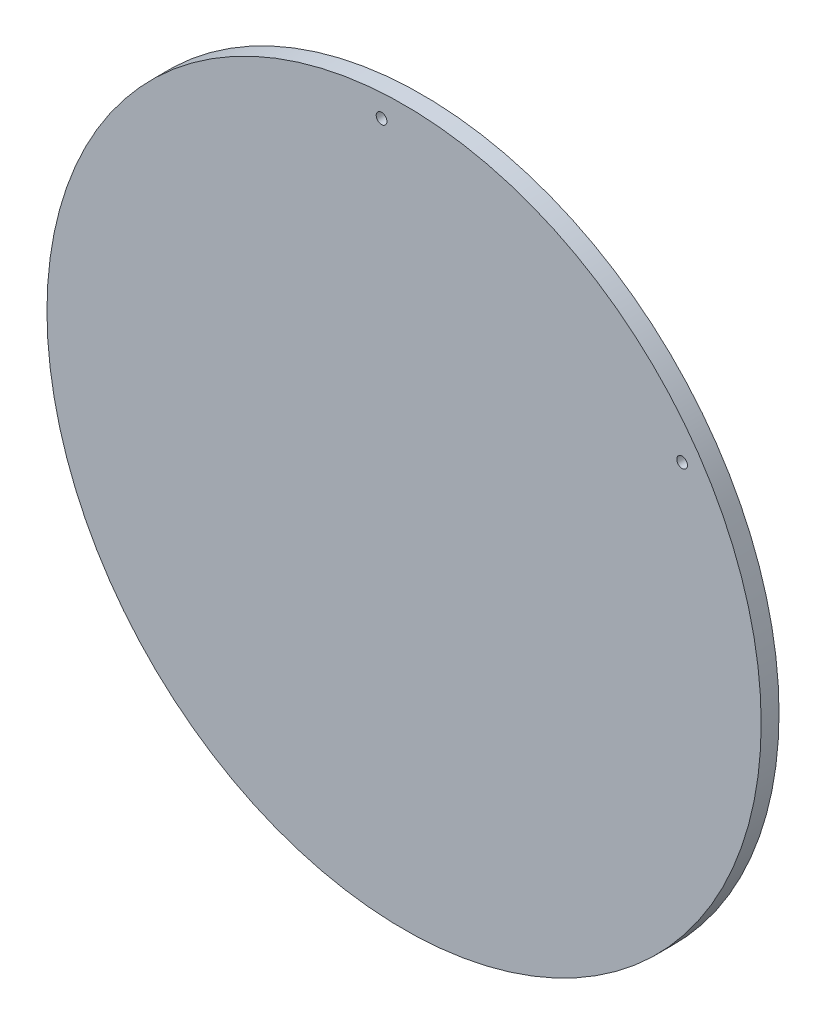
ISO-10303-21;
HEADER;
FILE_DESCRIPTION(('STEP AP214'),'2;1');
FILE_NAME('part.step','',(''),(''),'','','');
FILE_SCHEMA(('AUTOMOTIVE_DESIGN { 1 0 10303 214 1 1 1 1 }'));
ENDSEC;
DATA;
#1=APPLICATION_CONTEXT('core data for automotive mechanical design processes');
#2=APPLICATION_PROTOCOL_DEFINITION('international standard','automotive_design',2000,#1);
#3=PRODUCT_CONTEXT('',#1,'mechanical');
#4=PRODUCT('Part','Part','',(#3));
#5=PRODUCT_RELATED_PRODUCT_CATEGORY('part','',(#4));
#6=PRODUCT_DEFINITION_FORMATION('','',#4);
#7=PRODUCT_DEFINITION_CONTEXT('part definition',#1,'design');
#8=PRODUCT_DEFINITION('design','',#6,#7);
#9=PRODUCT_DEFINITION_SHAPE('','',#8);
#10=(LENGTH_UNIT() NAMED_UNIT(*) SI_UNIT(.MILLI.,.METRE.));
#11=(NAMED_UNIT(*) PLANE_ANGLE_UNIT() SI_UNIT($,.RADIAN.));
#12=(NAMED_UNIT(*) SI_UNIT($,.STERADIAN.) SOLID_ANGLE_UNIT());
#13=UNCERTAINTY_MEASURE_WITH_UNIT(LENGTH_MEASURE(1.E-05),#10,'distance_accuracy_value','');
#14=(GEOMETRIC_REPRESENTATION_CONTEXT(3) GLOBAL_UNCERTAINTY_ASSIGNED_CONTEXT((#13)) GLOBAL_UNIT_ASSIGNED_CONTEXT((#10,
#11,#12)) REPRESENTATION_CONTEXT('',''));
#15=CARTESIAN_POINT('',(0.,0.,0.));
#16=DIRECTION('',(0.,0.,1.));
#17=DIRECTION('',(1.,0.,0.));
#18=AXIS2_PLACEMENT_3D('',#15,#16,#17);
#19=CARTESIAN_POINT('',(0.289897698859799,0.590623923552289,55.));
#20=DIRECTION('',(0.,0.,1.));
#21=DIRECTION('',(1.,0.,0.));
#22=AXIS2_PLACEMENT_3D('',#19,#20,#21);
#23=PLANE('',#22);
#24=CARTESIAN_POINT('',(1557.35329906048,1045.18555218051,55.));
#25=DIRECTION('',(0.,0.,1.));
#26=DIRECTION('',(1.,0.,0.));
#27=AXIS2_PLACEMENT_3D('',#24,#25,#26);
#28=CIRCLE('',#27,30.);
#29=CARTESIAN_POINT('',(1587.35329906048,1045.18555218051,55.));
#30=VERTEX_POINT('',#29);
#31=EDGE_CURVE('E69',#30,#30,#28,.T.);
#32=ORIENTED_EDGE('',*,*,#31,.F.);
#33=EDGE_LOOP('',(#32));
#34=FACE_BOUND('',#33,.T.);
#35=CARTESIAN_POINT('',(0.289897698859799,0.590623923552289,55.));
#36=DIRECTION('',(0.,0.,1.));
#37=DIRECTION('',(1.,0.,0.));
#38=AXIS2_PLACEMENT_3D('',#35,#36,#37);
#39=CIRCLE('',#38,2000.);
#40=CARTESIAN_POINT('',(2000.28989769886,0.590623923552289,55.));
#41=VERTEX_POINT('',#40);
#42=EDGE_CURVE('E12',#41,#41,#39,.T.);
#43=ORIENTED_EDGE('',*,*,#42,.T.);
#44=EDGE_LOOP('',(#43));
#45=FACE_BOUND('',#44,.T.);
#46=CARTESIAN_POINT('',(-125.824146155218,1871.34454893421,55.));
#47=DIRECTION('',(0.,0.,1.));
#48=DIRECTION('',(1.,0.,0.));
#49=AXIS2_PLACEMENT_3D('',#46,#47,#48);
#50=CIRCLE('',#49,30.);
#51=CARTESIAN_POINT('',(-95.8241461552184,1871.34454893421,55.));
#52=VERTEX_POINT('',#51);
#53=EDGE_CURVE('E75',#52,#52,#50,.T.);
#54=ORIENTED_EDGE('',*,*,#53,.F.);
#55=EDGE_LOOP('',(#54));
#56=FACE_BOUND('',#55,.T.);
#57=ADVANCED_FACE('F56',(#34,#45,#56),#23,.T.);
#58=CARTESIAN_POINT('',(0.289897698859799,0.590623923552289,-45.));
#59=DIRECTION('',(0.,0.,1.));
#60=DIRECTION('',(1.,0.,0.));
#61=AXIS2_PLACEMENT_3D('',#58,#59,#60);
#62=PLANE('',#61);
#63=CARTESIAN_POINT('',(0.289897698859799,0.590623923552289,-45.));
#64=DIRECTION('',(0.,0.,1.));
#65=DIRECTION('',(1.,0.,0.));
#66=AXIS2_PLACEMENT_3D('',#63,#64,#65);
#67=CIRCLE('',#66,2000.);
#68=CARTESIAN_POINT('',(2000.28989769886,0.590623923552289,-45.));
#69=VERTEX_POINT('',#68);
#70=EDGE_CURVE('E60',#69,#69,#67,.T.);
#71=ORIENTED_EDGE('',*,*,#70,.F.);
#72=EDGE_LOOP('',(#71));
#73=FACE_BOUND('',#72,.T.);
#74=CARTESIAN_POINT('',(1557.35329906048,1045.18555218051,-45.));
#75=DIRECTION('',(0.,0.,1.));
#76=DIRECTION('',(1.,0.,0.));
#77=AXIS2_PLACEMENT_3D('',#74,#75,#76);
#78=CIRCLE('',#77,30.);
#79=CARTESIAN_POINT('',(1587.35329906048,1045.18555218051,-45.));
#80=VERTEX_POINT('',#79);
#81=EDGE_CURVE('E71',#80,#80,#78,.T.);
#82=ORIENTED_EDGE('',*,*,#81,.T.);
#83=EDGE_LOOP('',(#82));
#84=FACE_BOUND('',#83,.T.);
#85=CARTESIAN_POINT('',(-125.824146155218,1871.34454893421,-45.));
#86=DIRECTION('',(0.,0.,1.));
#87=DIRECTION('',(1.,0.,0.));
#88=AXIS2_PLACEMENT_3D('',#85,#86,#87);
#89=CIRCLE('',#88,30.);
#90=CARTESIAN_POINT('',(-95.8241461552184,1871.34454893421,-45.));
#91=VERTEX_POINT('',#90);
#92=EDGE_CURVE('E79',#91,#91,#89,.T.);
#93=ORIENTED_EDGE('',*,*,#92,.T.);
#94=EDGE_LOOP('',(#93));
#95=FACE_BOUND('',#94,.T.);
#96=ADVANCED_FACE('F91',(#73,#84,#95),#62,.F.);
#97=CARTESIAN_POINT('',(0.289897698859799,0.590623923552289,55.));
#98=DIRECTION('',(0.,0.,-1.));
#99=DIRECTION('',(-1.,0.,0.));
#100=AXIS2_PLACEMENT_3D('',#97,#98,#99);
#101=CYLINDRICAL_SURFACE('',#100,2000.);
#102=ORIENTED_EDGE('',*,*,#42,.F.);
#103=EDGE_LOOP('',(#102));
#104=FACE_BOUND('',#103,.T.);
#105=ORIENTED_EDGE('',*,*,#70,.T.);
#106=EDGE_LOOP('',(#105));
#107=FACE_BOUND('',#106,.T.);
#108=ADVANCED_FACE('F58',(#104,#107),#101,.T.);
#109=CARTESIAN_POINT('',(1557.35329906048,1045.18555218051,55.));
#110=DIRECTION('',(0.,0.,-1.));
#111=DIRECTION('',(-1.,0.,0.));
#112=AXIS2_PLACEMENT_3D('',#109,#110,#111);
#113=CYLINDRICAL_SURFACE('',#112,30.);
#114=ORIENTED_EDGE('',*,*,#31,.T.);
#115=EDGE_LOOP('',(#114));
#116=FACE_BOUND('',#115,.T.);
#117=ORIENTED_EDGE('',*,*,#81,.F.);
#118=EDGE_LOOP('',(#117));
#119=FACE_BOUND('',#118,.T.);
#120=ADVANCED_FACE('F100',(#116,#119),#113,.F.);
#121=CARTESIAN_POINT('',(-125.824146155218,1871.34454893421,55.));
#122=DIRECTION('',(0.,0.,-1.));
#123=DIRECTION('',(-1.,0.,0.));
#124=AXIS2_PLACEMENT_3D('',#121,#122,#123);
#125=CYLINDRICAL_SURFACE('',#124,30.);
#126=ORIENTED_EDGE('',*,*,#53,.T.);
#127=EDGE_LOOP('',(#126));
#128=FACE_BOUND('',#127,.T.);
#129=ORIENTED_EDGE('',*,*,#92,.F.);
#130=EDGE_LOOP('',(#129));
#131=FACE_BOUND('',#130,.T.);
#132=ADVANCED_FACE('F87',(#128,#131),#125,.F.);
#133=CLOSED_SHELL('',(#57,#96,#108,#120,#132));
#134=MANIFOLD_SOLID_BREP('B2',#133);
#135=ADVANCED_BREP_SHAPE_REPRESENTATION('',(#18,#134),#14);
#136=SHAPE_DEFINITION_REPRESENTATION(#9,#135);
ENDSEC;
END-ISO-10303-21;
